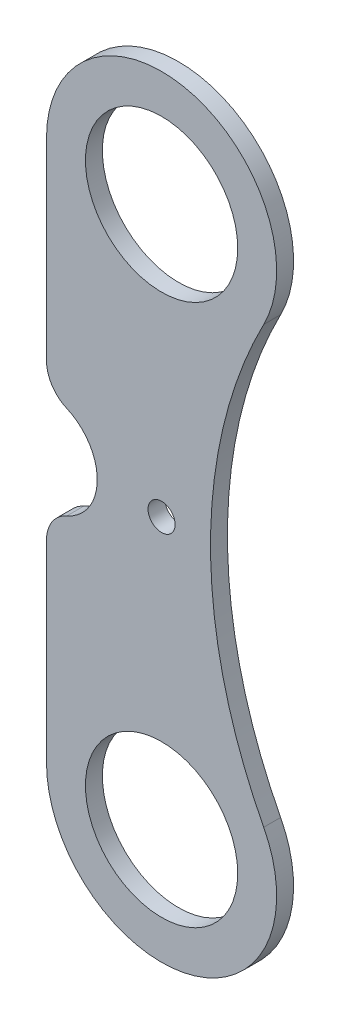
ISO-10303-21;
HEADER;
FILE_DESCRIPTION(('STEP AP214'),'2;1');
FILE_NAME('part.step','',(''),(''),'','','');
FILE_SCHEMA(('AUTOMOTIVE_DESIGN { 1 0 10303 214 1 1 1 1 }'));
ENDSEC;
DATA;
#1=APPLICATION_CONTEXT('core data for automotive mechanical design processes');
#2=APPLICATION_PROTOCOL_DEFINITION('international standard','automotive_design',2000,#1);
#3=PRODUCT_CONTEXT('',#1,'mechanical');
#4=PRODUCT('Part','Part','',(#3));
#5=PRODUCT_RELATED_PRODUCT_CATEGORY('part','',(#4));
#6=PRODUCT_DEFINITION_FORMATION('','',#4);
#7=PRODUCT_DEFINITION_CONTEXT('part definition',#1,'design');
#8=PRODUCT_DEFINITION('design','',#6,#7);
#9=PRODUCT_DEFINITION_SHAPE('','',#8);
#10=(LENGTH_UNIT() NAMED_UNIT(*) SI_UNIT(.MILLI.,.METRE.));
#11=(NAMED_UNIT(*) PLANE_ANGLE_UNIT() SI_UNIT($,.RADIAN.));
#12=(NAMED_UNIT(*) SI_UNIT($,.STERADIAN.) SOLID_ANGLE_UNIT());
#13=UNCERTAINTY_MEASURE_WITH_UNIT(LENGTH_MEASURE(1.E-05),#10,'distance_accuracy_value','');
#14=(GEOMETRIC_REPRESENTATION_CONTEXT(3) GLOBAL_UNCERTAINTY_ASSIGNED_CONTEXT((#13)) GLOBAL_UNIT_ASSIGNED_CONTEXT((#10,
#11,#12)) REPRESENTATION_CONTEXT('',''));
#15=CARTESIAN_POINT('',(0.,0.,0.));
#16=DIRECTION('',(0.,0.,1.));
#17=DIRECTION('',(1.,0.,0.));
#18=AXIS2_PLACEMENT_3D('',#15,#16,#17);
#19=CARTESIAN_POINT('',(0.,-101.6,3.175));
#20=DIRECTION('',(0.,0.,-1.));
#21=DIRECTION('',(-1.,0.,0.));
#22=AXIS2_PLACEMENT_3D('',#19,#20,#21);
#23=CYLINDRICAL_SURFACE('',#22,14.2875);
#24=CARTESIAN_POINT('',(0.,-101.6,3.175));
#25=DIRECTION('',(0.,0.,1.));
#26=DIRECTION('',(1.,0.,0.));
#27=AXIS2_PLACEMENT_3D('',#24,#25,#26);
#28=CIRCLE('',#27,14.2875);
#29=CARTESIAN_POINT('',(14.2875,-101.6,3.175));
#30=VERTEX_POINT('',#29);
#31=EDGE_CURVE('E220',#30,#30,#28,.T.);
#32=ORIENTED_EDGE('',*,*,#31,.T.);
#33=EDGE_LOOP('',(#32));
#34=FACE_BOUND('',#33,.T.);
#35=CARTESIAN_POINT('',(0.,-101.6,0.));
#36=DIRECTION('',(0.,0.,1.));
#37=DIRECTION('',(1.,0.,0.));
#38=AXIS2_PLACEMENT_3D('',#35,#36,#37);
#39=CIRCLE('',#38,14.2875);
#40=CARTESIAN_POINT('',(14.2875,-101.6,0.));
#41=VERTEX_POINT('',#40);
#42=EDGE_CURVE('E217',#41,#41,#39,.T.);
#43=ORIENTED_EDGE('',*,*,#42,.F.);
#44=EDGE_LOOP('',(#43));
#45=FACE_BOUND('',#44,.T.);
#46=ADVANCED_FACE('F70',(#34,#45),#23,.F.);
#47=CARTESIAN_POINT('',(0.,0.,3.175));
#48=DIRECTION('',(0.,0.,-1.));
#49=DIRECTION('',(-1.,0.,0.));
#50=AXIS2_PLACEMENT_3D('',#47,#48,#49);
#51=CYLINDRICAL_SURFACE('',#50,14.2875);
#52=CARTESIAN_POINT('',(0.,0.,3.175));
#53=DIRECTION('',(0.,0.,1.));
#54=DIRECTION('',(1.,0.,0.));
#55=AXIS2_PLACEMENT_3D('',#52,#53,#54);
#56=CIRCLE('',#55,14.2875);
#57=CARTESIAN_POINT('',(14.2875,0.,3.175));
#58=VERTEX_POINT('',#57);
#59=EDGE_CURVE('E160',#58,#58,#56,.T.);
#60=ORIENTED_EDGE('',*,*,#59,.T.);
#61=EDGE_LOOP('',(#60));
#62=FACE_BOUND('',#61,.T.);
#63=CARTESIAN_POINT('',(0.,0.,0.));
#64=DIRECTION('',(0.,0.,1.));
#65=DIRECTION('',(1.,0.,0.));
#66=AXIS2_PLACEMENT_3D('',#63,#64,#65);
#67=CIRCLE('',#66,14.2875);
#68=CARTESIAN_POINT('',(14.2875,0.,0.));
#69=VERTEX_POINT('',#68);
#70=EDGE_CURVE('E164',#69,#69,#67,.T.);
#71=ORIENTED_EDGE('',*,*,#70,.F.);
#72=EDGE_LOOP('',(#71));
#73=FACE_BOUND('',#72,.T.);
#74=ADVANCED_FACE('F229',(#62,#73),#51,.F.);
#75=CARTESIAN_POINT('',(0.,-50.8,3.175));
#76=DIRECTION('',(0.,0.,-1.));
#77=DIRECTION('',(-1.,0.,0.));
#78=AXIS2_PLACEMENT_3D('',#75,#76,#77);
#79=CYLINDRICAL_SURFACE('',#78,2.54);
#80=CARTESIAN_POINT('',(0.,-50.8,3.175));
#81=DIRECTION('',(0.,0.,1.));
#82=DIRECTION('',(1.,0.,0.));
#83=AXIS2_PLACEMENT_3D('',#80,#81,#82);
#84=CIRCLE('',#83,2.54);
#85=CARTESIAN_POINT('',(2.54000000000001,-50.8,3.175));
#86=VERTEX_POINT('',#85);
#87=EDGE_CURVE('E214',#86,#86,#84,.T.);
#88=ORIENTED_EDGE('',*,*,#87,.T.);
#89=EDGE_LOOP('',(#88));
#90=FACE_BOUND('',#89,.T.);
#91=CARTESIAN_POINT('',(0.,-50.8,0.));
#92=DIRECTION('',(0.,0.,1.));
#93=DIRECTION('',(1.,0.,0.));
#94=AXIS2_PLACEMENT_3D('',#91,#92,#93);
#95=CIRCLE('',#94,2.54);
#96=CARTESIAN_POINT('',(2.54000000000001,-50.8,0.));
#97=VERTEX_POINT('',#96);
#98=EDGE_CURVE('E212',#97,#97,#95,.T.);
#99=ORIENTED_EDGE('',*,*,#98,.F.);
#100=EDGE_LOOP('',(#99));
#101=FACE_BOUND('',#100,.T.);
#102=ADVANCED_FACE('F231',(#90,#101),#79,.F.);
#103=CARTESIAN_POINT('',(-21.59,12.7,3.175));
#104=DIRECTION('',(1.,0.,0.));
#105=DIRECTION('',(0.,1.,0.));
#106=AXIS2_PLACEMENT_3D('',#103,#104,#105);
#107=PLANE('',#106);
#108=DIRECTION('',(0.,-1.,0.));
#109=VECTOR('',#108,1.);
#110=CARTESIAN_POINT('',(-21.59,12.7,3.175));
#111=LINE('',#110,#109);
#112=CARTESIAN_POINT('',(-21.59,0.,3.175));
#113=VERTEX_POINT('',#112);
#114=CARTESIAN_POINT('',(-21.59,-36.2503221685152,3.175));
#115=VERTEX_POINT('',#114);
#116=EDGE_CURVE('E92',#113,#115,#111,.T.);
#117=ORIENTED_EDGE('',*,*,#116,.F.);
#118=DIRECTION('',(0.,0.,1.));
#119=VECTOR('',#118,1.);
#120=CARTESIAN_POINT('',(-21.59,0.,0.));
#121=LINE('',#120,#119);
#122=CARTESIAN_POINT('',(-21.59,0.,0.));
#123=VERTEX_POINT('',#122);
#124=EDGE_CURVE('E155',#123,#113,#121,.T.);
#125=ORIENTED_EDGE('',*,*,#124,.F.);
#126=DIRECTION('',(0.,-1.,0.));
#127=VECTOR('',#126,1.);
#128=CARTESIAN_POINT('',(-21.59,12.7,0.));
#129=LINE('',#128,#127);
#130=CARTESIAN_POINT('',(-21.59,-36.2503221685152,0.));
#131=VERTEX_POINT('',#130);
#132=EDGE_CURVE('E159',#123,#131,#129,.T.);
#133=ORIENTED_EDGE('',*,*,#132,.T.);
#134=DIRECTION('',(0.,0.,1.));
#135=VECTOR('',#134,1.);
#136=CARTESIAN_POINT('',(-21.59,-36.2503221685152,3.175));
#137=LINE('',#136,#135);
#138=EDGE_CURVE('E179',#131,#115,#137,.T.);
#139=ORIENTED_EDGE('',*,*,#138,.T.);
#140=EDGE_LOOP('',(#117,#125,#133,#139));
#141=FACE_BOUND('',#140,.T.);
#142=ADVANCED_FACE('F238',(#141),#107,.F.);
#143=CARTESIAN_POINT('',(-21.59,-65.3496778314848,0.));
#144=VERTEX_POINT('',#143);
#145=CARTESIAN_POINT('',(-21.59,-101.6,0.));
#146=VERTEX_POINT('',#145);
#147=EDGE_CURVE('E141',#144,#146,#129,.T.);
#148=ORIENTED_EDGE('',*,*,#147,.T.);
#149=DIRECTION('',(0.,0.,1.));
#150=VECTOR('',#149,1.);
#151=CARTESIAN_POINT('',(-21.59,-101.6,0.));
#152=LINE('',#151,#150);
#153=CARTESIAN_POINT('',(-21.59,-101.6,3.175));
#154=VERTEX_POINT('',#153);
#155=EDGE_CURVE('E151',#146,#154,#152,.T.);
#156=ORIENTED_EDGE('',*,*,#155,.T.);
#157=CARTESIAN_POINT('',(-21.59,-65.3496778314848,3.175));
#158=VERTEX_POINT('',#157);
#159=EDGE_CURVE('E162',#158,#154,#111,.T.);
#160=ORIENTED_EDGE('',*,*,#159,.F.);
#161=DIRECTION('',(0.,0.,1.));
#162=VECTOR('',#161,1.);
#163=CARTESIAN_POINT('',(-21.59,-65.3496778314848,0.));
#164=LINE('',#163,#162);
#165=EDGE_CURVE('E12',#158,#144,#164,.F.);
#166=ORIENTED_EDGE('',*,*,#165,.T.);
#167=EDGE_LOOP('',(#148,#156,#160,#166));
#168=FACE_BOUND('',#167,.T.);
#169=ADVANCED_FACE('F157',(#168),#107,.F.);
#170=CARTESIAN_POINT('',(8.89000000000001,12.7,0.));
#171=DIRECTION('',(0.,0.,-1.));
#172=DIRECTION('',(-1.,0.,0.));
#173=AXIS2_PLACEMENT_3D('',#170,#171,#172);
#174=PLANE('',#173);
#175=CARTESIAN_POINT('',(0.,-101.6,0.));
#176=DIRECTION('',(0.,0.,-1.));
#177=DIRECTION('',(-1.,0.,0.));
#178=AXIS2_PLACEMENT_3D('',#175,#176,#177);
#179=CIRCLE('',#178,21.59);
#180=CARTESIAN_POINT('',(19.1590830035103,-91.6472296085661,0.));
#181=VERTEX_POINT('',#180);
#182=EDGE_CURVE('E136',#181,#146,#179,.T.);
#183=ORIENTED_EDGE('',*,*,#182,.T.);
#184=ORIENTED_EDGE('',*,*,#147,.F.);
#185=CARTESIAN_POINT('',(-15.24,-65.3496778314848,0.));
#186=DIRECTION('',(0.,0.,-1.));
#187=DIRECTION('',(-1.,0.,0.));
#188=AXIS2_PLACEMENT_3D('',#185,#186,#187);
#189=CIRCLE('',#188,6.35);
#190=CARTESIAN_POINT('',(-17.78,-59.5298066988909,0.));
#191=VERTEX_POINT('',#190);
#192=EDGE_CURVE('E174',#144,#191,#189,.T.);
#193=ORIENTED_EDGE('',*,*,#192,.T.);
#194=CARTESIAN_POINT('',(-21.59,-50.8,0.));
#195=DIRECTION('',(0.,0.,1.));
#196=DIRECTION('',(1.,0.,0.));
#197=AXIS2_PLACEMENT_3D('',#194,#195,#196);
#198=CIRCLE('',#197,9.525);
#199=CARTESIAN_POINT('',(-17.78,-42.0701933011091,0.));
#200=VERTEX_POINT('',#199);
#201=EDGE_CURVE('E194',#191,#200,#198,.T.);
#202=ORIENTED_EDGE('',*,*,#201,.T.);
#203=CARTESIAN_POINT('',(-15.24,-36.2503221685152,0.));
#204=DIRECTION('',(0.,0.,-1.));
#205=DIRECTION('',(-1.,0.,0.));
#206=AXIS2_PLACEMENT_3D('',#203,#204,#205);
#207=CIRCLE('',#206,6.35);
#208=EDGE_CURVE('E176',#200,#131,#207,.T.);
#209=ORIENTED_EDGE('',*,*,#208,.T.);
#210=ORIENTED_EDGE('',*,*,#132,.F.);
#211=CARTESIAN_POINT('',(0.,0.,0.));
#212=DIRECTION('',(0.,0.,-1.));
#213=DIRECTION('',(-1.,0.,0.));
#214=AXIS2_PLACEMENT_3D('',#211,#212,#213);
#215=CIRCLE('',#214,21.59);
#216=CARTESIAN_POINT('',(19.1590830035103,-9.9527703914339,0.));
#217=VERTEX_POINT('',#216);
#218=EDGE_CURVE('E148',#123,#217,#215,.T.);
#219=ORIENTED_EDGE('',*,*,#218,.T.);
#220=CARTESIAN_POINT('',(97.79,-50.8,0.));
#221=DIRECTION('',(0.,0.,-1.));
#222=DIRECTION('',(-1.,0.,0.));
#223=AXIS2_PLACEMENT_3D('',#220,#221,#222);
#224=CIRCLE('',#223,88.6076592310381);
#225=EDGE_CURVE('E144',#181,#217,#224,.T.);
#226=ORIENTED_EDGE('',*,*,#225,.F.);
#227=EDGE_LOOP('',(#183,#184,#193,#202,#209,#210,#219,#226));
#228=FACE_BOUND('',#227,.T.);
#229=ORIENTED_EDGE('',*,*,#98,.T.);
#230=EDGE_LOOP('',(#229));
#231=FACE_BOUND('',#230,.T.);
#232=ORIENTED_EDGE('',*,*,#70,.T.);
#233=EDGE_LOOP('',(#232));
#234=FACE_BOUND('',#233,.T.);
#235=ORIENTED_EDGE('',*,*,#42,.T.);
#236=EDGE_LOOP('',(#235));
#237=FACE_BOUND('',#236,.T.);
#238=ADVANCED_FACE('F138',(#228,#231,#234,#237),#174,.T.);
#239=CARTESIAN_POINT('',(8.89000000000001,12.7,3.175));
#240=DIRECTION('',(0.,0.,-1.));
#241=DIRECTION('',(-1.,0.,0.));
#242=AXIS2_PLACEMENT_3D('',#239,#240,#241);
#243=PLANE('',#242);
#244=ORIENTED_EDGE('',*,*,#159,.T.);
#245=CARTESIAN_POINT('',(0.,-101.6,3.175));
#246=DIRECTION('',(0.,0.,1.));
#247=DIRECTION('',(1.,0.,0.));
#248=AXIS2_PLACEMENT_3D('',#245,#246,#247);
#249=CIRCLE('',#248,21.59);
#250=CARTESIAN_POINT('',(19.1590830035103,-91.6472296085661,3.175));
#251=VERTEX_POINT('',#250);
#252=EDGE_CURVE('E147',#154,#251,#249,.T.);
#253=ORIENTED_EDGE('',*,*,#252,.T.);
#254=CARTESIAN_POINT('',(97.79,-50.8,3.175));
#255=DIRECTION('',(0.,0.,-1.));
#256=DIRECTION('',(-1.,0.,0.));
#257=AXIS2_PLACEMENT_3D('',#254,#255,#256);
#258=CIRCLE('',#257,88.6076592310381);
#259=CARTESIAN_POINT('',(19.1590830035103,-9.9527703914339,3.175));
#260=VERTEX_POINT('',#259);
#261=EDGE_CURVE('E203',#251,#260,#258,.T.);
#262=ORIENTED_EDGE('',*,*,#261,.T.);
#263=CARTESIAN_POINT('',(0.,0.,3.175));
#264=DIRECTION('',(0.,0.,-1.));
#265=DIRECTION('',(-1.,0.,0.));
#266=AXIS2_PLACEMENT_3D('',#263,#264,#265);
#267=CIRCLE('',#266,21.59);
#268=EDGE_CURVE('E206',#113,#260,#267,.T.);
#269=ORIENTED_EDGE('',*,*,#268,.F.);
#270=ORIENTED_EDGE('',*,*,#116,.T.);
#271=CARTESIAN_POINT('',(-15.24,-36.2503221685152,3.175));
#272=DIRECTION('',(0.,0.,-1.));
#273=DIRECTION('',(-1.,0.,0.));
#274=AXIS2_PLACEMENT_3D('',#271,#272,#273);
#275=CIRCLE('',#274,6.35);
#276=CARTESIAN_POINT('',(-17.78,-42.0701933011091,3.175));
#277=VERTEX_POINT('',#276);
#278=EDGE_CURVE('E78',#115,#277,#275,.F.);
#279=ORIENTED_EDGE('',*,*,#278,.T.);
#280=CARTESIAN_POINT('',(-21.59,-50.8,3.175));
#281=DIRECTION('',(0.,0.,1.));
#282=DIRECTION('',(1.,0.,0.));
#283=AXIS2_PLACEMENT_3D('',#280,#281,#282);
#284=CIRCLE('',#283,9.525);
#285=CARTESIAN_POINT('',(-17.78,-59.5298066988909,3.175));
#286=VERTEX_POINT('',#285);
#287=EDGE_CURVE('E185',#286,#277,#284,.T.);
#288=ORIENTED_EDGE('',*,*,#287,.F.);
#289=CARTESIAN_POINT('',(-15.24,-65.3496778314848,3.175));
#290=DIRECTION('',(0.,0.,-1.));
#291=DIRECTION('',(-1.,0.,0.));
#292=AXIS2_PLACEMENT_3D('',#289,#290,#291);
#293=CIRCLE('',#292,6.35);
#294=EDGE_CURVE('E85',#286,#158,#293,.F.);
#295=ORIENTED_EDGE('',*,*,#294,.T.);
#296=EDGE_LOOP('',(#244,#253,#262,#269,#270,#279,#288,#295));
#297=FACE_BOUND('',#296,.T.);
#298=ORIENTED_EDGE('',*,*,#59,.F.);
#299=EDGE_LOOP('',(#298));
#300=FACE_BOUND('',#299,.T.);
#301=ORIENTED_EDGE('',*,*,#31,.F.);
#302=EDGE_LOOP('',(#301));
#303=FACE_BOUND('',#302,.T.);
#304=ORIENTED_EDGE('',*,*,#87,.F.);
#305=EDGE_LOOP('',(#304));
#306=FACE_BOUND('',#305,.T.);
#307=ADVANCED_FACE('F183',(#297,#300,#303,#306),#243,.F.);
#308=CARTESIAN_POINT('',(0.,0.,3.175));
#309=DIRECTION('',(0.,0.,-1.));
#310=DIRECTION('',(-1.,0.,0.));
#311=AXIS2_PLACEMENT_3D('',#308,#309,#310);
#312=CYLINDRICAL_SURFACE('',#311,21.59);
#313=ORIENTED_EDGE('',*,*,#218,.F.);
#314=ORIENTED_EDGE('',*,*,#124,.T.);
#315=ORIENTED_EDGE('',*,*,#268,.T.);
#316=DIRECTION('',(0.,0.,-1.));
#317=VECTOR('',#316,1.);
#318=CARTESIAN_POINT('',(19.1590830035103,-9.9527703914339,3.175));
#319=LINE('',#318,#317);
#320=EDGE_CURVE('E210',#260,#217,#319,.T.);
#321=ORIENTED_EDGE('',*,*,#320,.T.);
#322=EDGE_LOOP('',(#313,#314,#315,#321));
#323=FACE_BOUND('',#322,.T.);
#324=ADVANCED_FACE('F246',(#323),#312,.T.);
#325=CARTESIAN_POINT('',(97.79,-50.8,3.175));
#326=DIRECTION('',(0.,0.,-1.));
#327=DIRECTION('',(-1.,0.,0.));
#328=AXIS2_PLACEMENT_3D('',#325,#326,#327);
#329=CYLINDRICAL_SURFACE('',#328,88.6076592310381);
#330=ORIENTED_EDGE('',*,*,#225,.T.);
#331=ORIENTED_EDGE('',*,*,#320,.F.);
#332=ORIENTED_EDGE('',*,*,#261,.F.);
#333=DIRECTION('',(0.,0.,-1.));
#334=VECTOR('',#333,1.);
#335=CARTESIAN_POINT('',(19.1590830035103,-91.6472296085661,3.175));
#336=LINE('',#335,#334);
#337=EDGE_CURVE('E207',#251,#181,#336,.T.);
#338=ORIENTED_EDGE('',*,*,#337,.T.);
#339=EDGE_LOOP('',(#330,#331,#332,#338));
#340=FACE_BOUND('',#339,.T.);
#341=ADVANCED_FACE('F260',(#340),#329,.F.);
#342=CARTESIAN_POINT('',(0.,-101.6,3.175));
#343=DIRECTION('',(0.,0.,-1.));
#344=DIRECTION('',(-1.,0.,0.));
#345=AXIS2_PLACEMENT_3D('',#342,#343,#344);
#346=CYLINDRICAL_SURFACE('',#345,21.59);
#347=ORIENTED_EDGE('',*,*,#252,.F.);
#348=ORIENTED_EDGE('',*,*,#155,.F.);
#349=ORIENTED_EDGE('',*,*,#182,.F.);
#350=ORIENTED_EDGE('',*,*,#337,.F.);
#351=EDGE_LOOP('',(#347,#348,#349,#350));
#352=FACE_BOUND('',#351,.T.);
#353=ADVANCED_FACE('F152',(#352),#346,.T.);
#354=CARTESIAN_POINT('',(-21.59,-50.8,3.175));
#355=DIRECTION('',(0.,0.,-1.));
#356=DIRECTION('',(-1.,0.,0.));
#357=AXIS2_PLACEMENT_3D('',#354,#355,#356);
#358=CYLINDRICAL_SURFACE('',#357,9.525);
#359=ORIENTED_EDGE('',*,*,#287,.T.);
#360=DIRECTION('',(0.,0.,-1.));
#361=VECTOR('',#360,1.);
#362=CARTESIAN_POINT('',(-17.78,-42.0701933011091,3.175));
#363=LINE('',#362,#361);
#364=EDGE_CURVE('E171',#277,#200,#363,.T.);
#365=ORIENTED_EDGE('',*,*,#364,.T.);
#366=ORIENTED_EDGE('',*,*,#201,.F.);
#367=DIRECTION('',(0.,0.,-1.));
#368=VECTOR('',#367,1.);
#369=CARTESIAN_POINT('',(-17.78,-59.5298066988909,3.175));
#370=LINE('',#369,#368);
#371=EDGE_CURVE('E169',#191,#286,#370,.F.);
#372=ORIENTED_EDGE('',*,*,#371,.T.);
#373=EDGE_LOOP('',(#359,#365,#366,#372));
#374=FACE_BOUND('',#373,.T.);
#375=ADVANCED_FACE('F190',(#374),#358,.F.);
#376=CARTESIAN_POINT('',(-15.24,-36.2503221685152,3.175));
#377=DIRECTION('',(0.,0.,-1.));
#378=DIRECTION('',(-1.,0.,0.));
#379=AXIS2_PLACEMENT_3D('',#376,#377,#378);
#380=CYLINDRICAL_SURFACE('',#379,6.35);
#381=ORIENTED_EDGE('',*,*,#278,.F.);
#382=ORIENTED_EDGE('',*,*,#138,.F.);
#383=ORIENTED_EDGE('',*,*,#208,.F.);
#384=ORIENTED_EDGE('',*,*,#364,.F.);
#385=EDGE_LOOP('',(#381,#382,#383,#384));
#386=FACE_BOUND('',#385,.T.);
#387=ADVANCED_FACE('F196',(#386),#380,.T.);
#388=CARTESIAN_POINT('',(-15.24,-65.3496778314848,3.175));
#389=DIRECTION('',(0.,0.,-1.));
#390=DIRECTION('',(-1.,0.,0.));
#391=AXIS2_PLACEMENT_3D('',#388,#389,#390);
#392=CYLINDRICAL_SURFACE('',#391,6.35);
#393=ORIENTED_EDGE('',*,*,#294,.F.);
#394=ORIENTED_EDGE('',*,*,#371,.F.);
#395=ORIENTED_EDGE('',*,*,#192,.F.);
#396=ORIENTED_EDGE('',*,*,#165,.F.);
#397=EDGE_LOOP('',(#393,#394,#395,#396));
#398=FACE_BOUND('',#397,.T.);
#399=ADVANCED_FACE('F72',(#398),#392,.T.);
#400=CLOSED_SHELL('',(#46,#74,#102,#142,#169,#238,#307,#324,#341,#353,#375,#387,#399));
#401=MANIFOLD_SOLID_BREP('B2',#400);
#402=ADVANCED_BREP_SHAPE_REPRESENTATION('',(#18,#401),#14);
#403=SHAPE_DEFINITION_REPRESENTATION(#9,#402);
ENDSEC;
END-ISO-10303-21;
